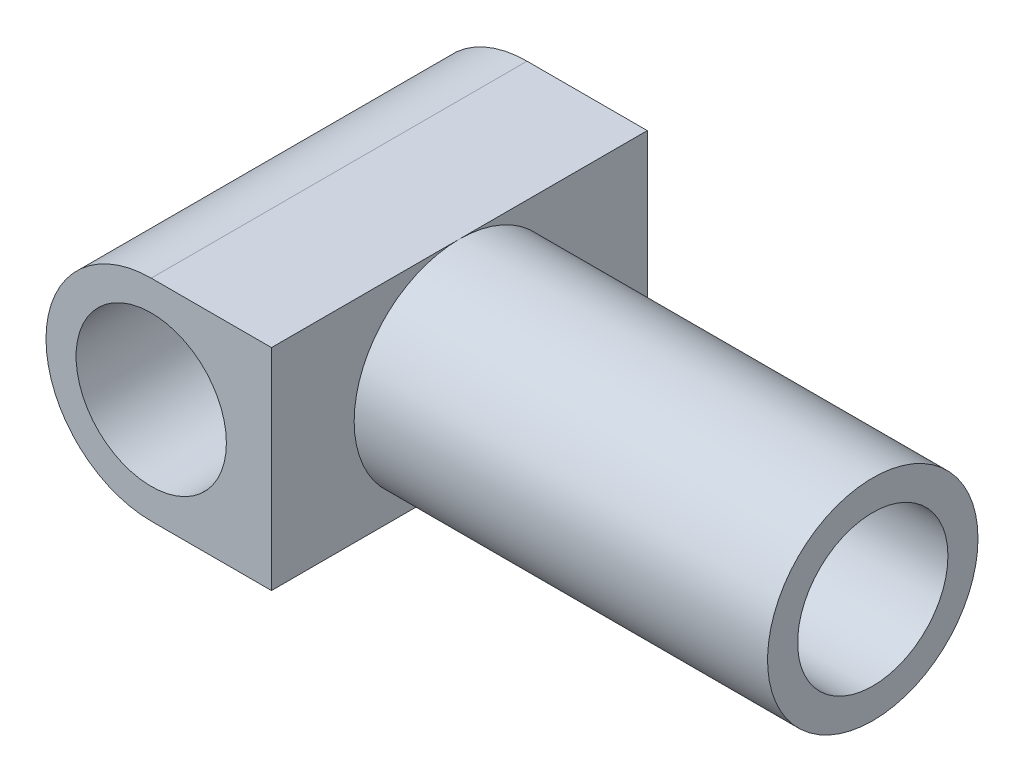
ISO-10303-21;
HEADER;
FILE_DESCRIPTION(('STEP AP214'),'2;1');
FILE_NAME('part.step','',(''),(''),'','','');
FILE_SCHEMA(('AUTOMOTIVE_DESIGN { 1 0 10303 214 1 1 1 1 }'));
ENDSEC;
DATA;
#1=APPLICATION_CONTEXT('core data for automotive mechanical design processes');
#2=APPLICATION_PROTOCOL_DEFINITION('international standard','automotive_design',2000,#1);
#3=PRODUCT_CONTEXT('',#1,'mechanical');
#4=PRODUCT('Part','Part','',(#3));
#5=PRODUCT_RELATED_PRODUCT_CATEGORY('part','',(#4));
#6=PRODUCT_DEFINITION_FORMATION('','',#4);
#7=PRODUCT_DEFINITION_CONTEXT('part definition',#1,'design');
#8=PRODUCT_DEFINITION('design','',#6,#7);
#9=PRODUCT_DEFINITION_SHAPE('','',#8);
#10=(LENGTH_UNIT() NAMED_UNIT(*) SI_UNIT(.MILLI.,.METRE.));
#11=(NAMED_UNIT(*) PLANE_ANGLE_UNIT() SI_UNIT($,.RADIAN.));
#12=(NAMED_UNIT(*) SI_UNIT($,.STERADIAN.) SOLID_ANGLE_UNIT());
#13=UNCERTAINTY_MEASURE_WITH_UNIT(LENGTH_MEASURE(1.E-05),#10,'distance_accuracy_value','');
#14=(GEOMETRIC_REPRESENTATION_CONTEXT(3) GLOBAL_UNCERTAINTY_ASSIGNED_CONTEXT((#13)) GLOBAL_UNIT_ASSIGNED_CONTEXT((#10,
#11,#12)) REPRESENTATION_CONTEXT('',''));
#15=CARTESIAN_POINT('',(0.,0.,0.));
#16=DIRECTION('',(0.,0.,1.));
#17=DIRECTION('',(1.,0.,0.));
#18=AXIS2_PLACEMENT_3D('',#15,#16,#17);
#19=CARTESIAN_POINT('',(8.,7.,25.));
#20=DIRECTION('',(-1.,0.,0.));
#21=DIRECTION('',(0.,0.,1.));
#22=AXIS2_PLACEMENT_3D('',#19,#20,#21);
#23=PLANE('',#22);
#24=CARTESIAN_POINT('',(8.,0.,12.5));
#25=DIRECTION('',(1.,0.,0.));
#26=DIRECTION('',(0.,0.,-1.));
#27=AXIS2_PLACEMENT_3D('',#24,#25,#26);
#28=CIRCLE('',#27,7.);
#29=CARTESIAN_POINT('',(8.,7.,12.5));
#30=VERTEX_POINT('',#29);
#31=CARTESIAN_POINT('',(8.,-7.,12.5));
#32=VERTEX_POINT('',#31);
#33=EDGE_CURVE('E56',#30,#32,#28,.T.);
#34=ORIENTED_EDGE('',*,*,#33,.F.);
#35=DIRECTION('',(0.,0.,-1.));
#36=VECTOR('',#35,1.);
#37=CARTESIAN_POINT('',(8.,7.,25.));
#38=LINE('',#37,#36);
#39=CARTESIAN_POINT('',(8.,7.,25.));
#40=VERTEX_POINT('',#39);
#41=EDGE_CURVE('E101',#40,#30,#38,.T.);
#42=ORIENTED_EDGE('',*,*,#41,.F.);
#43=DIRECTION('',(0.,1.,0.));
#44=VECTOR('',#43,1.);
#45=CARTESIAN_POINT('',(8.,7.,25.));
#46=LINE('',#45,#44);
#47=CARTESIAN_POINT('',(8.,-7.,25.));
#48=VERTEX_POINT('',#47);
#49=EDGE_CURVE('E185',#48,#40,#46,.T.);
#50=ORIENTED_EDGE('',*,*,#49,.F.);
#51=DIRECTION('',(0.,0.,-1.));
#52=VECTOR('',#51,1.);
#53=CARTESIAN_POINT('',(8.,-7.,25.));
#54=LINE('',#53,#52);
#55=EDGE_CURVE('E118',#48,#32,#54,.T.);
#56=ORIENTED_EDGE('',*,*,#55,.T.);
#57=EDGE_LOOP('',(#34,#42,#50,#56));
#58=FACE_BOUND('',#57,.T.);
#59=ADVANCED_FACE('F45',(#58),#23,.F.);
#60=CARTESIAN_POINT('',(0.,0.,25.));
#61=DIRECTION('',(0.,0.,1.));
#62=DIRECTION('',(1.,0.,0.));
#63=AXIS2_PLACEMENT_3D('',#60,#61,#62);
#64=PLANE('',#63);
#65=CARTESIAN_POINT('',(0.,0.,25.));
#66=DIRECTION('',(0.,0.,1.));
#67=DIRECTION('',(1.,0.,0.));
#68=AXIS2_PLACEMENT_3D('',#65,#66,#67);
#69=CIRCLE('',#68,7.);
#70=CARTESIAN_POINT('',(0.,7.,25.));
#71=VERTEX_POINT('',#70);
#72=CARTESIAN_POINT('',(0.,-7.,25.));
#73=VERTEX_POINT('',#72);
#74=EDGE_CURVE('E175',#71,#73,#69,.T.);
#75=ORIENTED_EDGE('',*,*,#74,.T.);
#76=DIRECTION('',(1.,0.,0.));
#77=VECTOR('',#76,1.);
#78=CARTESIAN_POINT('',(8.,-7.,25.));
#79=LINE('',#78,#77);
#80=EDGE_CURVE('E97',#73,#48,#79,.T.);
#81=ORIENTED_EDGE('',*,*,#80,.T.);
#82=ORIENTED_EDGE('',*,*,#49,.T.);
#83=DIRECTION('',(-1.,0.,0.));
#84=VECTOR('',#83,1.);
#85=CARTESIAN_POINT('',(0.,7.,25.));
#86=LINE('',#85,#84);
#87=EDGE_CURVE('E70',#40,#71,#86,.T.);
#88=ORIENTED_EDGE('',*,*,#87,.T.);
#89=EDGE_LOOP('',(#75,#81,#82,#88));
#90=FACE_BOUND('',#89,.T.);
#91=CARTESIAN_POINT('',(0.,0.,25.));
#92=DIRECTION('',(0.,0.,1.));
#93=DIRECTION('',(1.,0.,0.));
#94=AXIS2_PLACEMENT_3D('',#91,#92,#93);
#95=CIRCLE('',#94,5.);
#96=CARTESIAN_POINT('',(5.,0.,25.));
#97=VERTEX_POINT('',#96);
#98=EDGE_CURVE('E197',#97,#97,#95,.T.);
#99=ORIENTED_EDGE('',*,*,#98,.F.);
#100=EDGE_LOOP('',(#99));
#101=FACE_BOUND('',#100,.T.);
#102=ADVANCED_FACE('F142',(#90,#101),#64,.T.);
#103=CARTESIAN_POINT('',(0.,0.,0.));
#104=DIRECTION('',(0.,0.,1.));
#105=DIRECTION('',(1.,0.,0.));
#106=AXIS2_PLACEMENT_3D('',#103,#104,#105);
#107=PLANE('',#106);
#108=CARTESIAN_POINT('',(0.,0.,0.));
#109=DIRECTION('',(0.,0.,1.));
#110=DIRECTION('',(1.,0.,0.));
#111=AXIS2_PLACEMENT_3D('',#108,#109,#110);
#112=CIRCLE('',#111,7.);
#113=CARTESIAN_POINT('',(0.,7.,0.));
#114=VERTEX_POINT('',#113);
#115=CARTESIAN_POINT('',(0.,-7.,0.));
#116=VERTEX_POINT('',#115);
#117=EDGE_CURVE('E169',#114,#116,#112,.T.);
#118=ORIENTED_EDGE('',*,*,#117,.F.);
#119=DIRECTION('',(-1.,0.,0.));
#120=VECTOR('',#119,1.);
#121=CARTESIAN_POINT('',(0.,7.,0.));
#122=LINE('',#121,#120);
#123=CARTESIAN_POINT('',(8.,7.,0.));
#124=VERTEX_POINT('',#123);
#125=EDGE_CURVE('E89',#124,#114,#122,.T.);
#126=ORIENTED_EDGE('',*,*,#125,.F.);
#127=DIRECTION('',(0.,1.,0.));
#128=VECTOR('',#127,1.);
#129=CARTESIAN_POINT('',(8.,7.,0.));
#130=LINE('',#129,#128);
#131=CARTESIAN_POINT('',(8.,-7.,0.));
#132=VERTEX_POINT('',#131);
#133=EDGE_CURVE('E113',#132,#124,#130,.T.);
#134=ORIENTED_EDGE('',*,*,#133,.F.);
#135=DIRECTION('',(1.,0.,0.));
#136=VECTOR('',#135,1.);
#137=CARTESIAN_POINT('',(8.,-7.,0.));
#138=LINE('',#137,#136);
#139=EDGE_CURVE('E163',#116,#132,#138,.T.);
#140=ORIENTED_EDGE('',*,*,#139,.F.);
#141=EDGE_LOOP('',(#118,#126,#134,#140));
#142=FACE_BOUND('',#141,.T.);
#143=CARTESIAN_POINT('',(0.,0.,0.));
#144=DIRECTION('',(0.,0.,1.));
#145=DIRECTION('',(1.,0.,0.));
#146=AXIS2_PLACEMENT_3D('',#143,#144,#145);
#147=CIRCLE('',#146,5.);
#148=CARTESIAN_POINT('',(5.,0.,0.));
#149=VERTEX_POINT('',#148);
#150=EDGE_CURVE('E194',#149,#149,#147,.T.);
#151=ORIENTED_EDGE('',*,*,#150,.T.);
#152=EDGE_LOOP('',(#151));
#153=FACE_BOUND('',#152,.T.);
#154=ADVANCED_FACE('F147',(#142,#153),#107,.F.);
#155=CARTESIAN_POINT('',(0.,0.,25.));
#156=DIRECTION('',(0.,0.,-1.));
#157=DIRECTION('',(-1.,0.,0.));
#158=AXIS2_PLACEMENT_3D('',#155,#156,#157);
#159=CYLINDRICAL_SURFACE('',#158,7.);
#160=ORIENTED_EDGE('',*,*,#117,.T.);
#161=DIRECTION('',(0.,0.,-1.));
#162=VECTOR('',#161,1.);
#163=CARTESIAN_POINT('',(0.,-7.,25.));
#164=LINE('',#163,#162);
#165=EDGE_CURVE('E49',#73,#116,#164,.T.);
#166=ORIENTED_EDGE('',*,*,#165,.F.);
#167=ORIENTED_EDGE('',*,*,#74,.F.);
#168=DIRECTION('',(0.,0.,-1.));
#169=VECTOR('',#168,1.);
#170=CARTESIAN_POINT('',(0.,7.,25.));
#171=LINE('',#170,#169);
#172=EDGE_CURVE('E115',#71,#114,#171,.T.);
#173=ORIENTED_EDGE('',*,*,#172,.T.);
#174=EDGE_LOOP('',(#160,#166,#167,#173));
#175=FACE_BOUND('',#174,.T.);
#176=ADVANCED_FACE('F47',(#175),#159,.T.);
#177=CARTESIAN_POINT('',(8.,-7.,25.));
#178=DIRECTION('',(0.,1.,0.));
#179=DIRECTION('',(0.,0.,1.));
#180=AXIS2_PLACEMENT_3D('',#177,#178,#179);
#181=PLANE('',#180);
#182=ORIENTED_EDGE('',*,*,#139,.T.);
#183=EDGE_CURVE('E109',#32,#132,#54,.T.);
#184=ORIENTED_EDGE('',*,*,#183,.F.);
#185=ORIENTED_EDGE('',*,*,#55,.F.);
#186=ORIENTED_EDGE('',*,*,#80,.F.);
#187=ORIENTED_EDGE('',*,*,#165,.T.);
#188=EDGE_LOOP('',(#182,#184,#185,#186,#187));
#189=FACE_BOUND('',#188,.T.);
#190=ADVANCED_FACE('F153',(#189),#181,.F.);
#191=EDGE_CURVE('E11',#32,#30,#28,.T.);
#192=ORIENTED_EDGE('',*,*,#191,.F.);
#193=ORIENTED_EDGE('',*,*,#183,.T.);
#194=ORIENTED_EDGE('',*,*,#133,.T.);
#195=EDGE_CURVE('E103',#30,#124,#38,.T.);
#196=ORIENTED_EDGE('',*,*,#195,.F.);
#197=EDGE_LOOP('',(#192,#193,#194,#196));
#198=FACE_BOUND('',#197,.T.);
#199=ADVANCED_FACE('F111',(#198),#23,.F.);
#200=CARTESIAN_POINT('',(0.,7.,25.));
#201=DIRECTION('',(0.,-1.,0.));
#202=DIRECTION('',(0.,0.,-1.));
#203=AXIS2_PLACEMENT_3D('',#200,#201,#202);
#204=PLANE('',#203);
#205=ORIENTED_EDGE('',*,*,#125,.T.);
#206=ORIENTED_EDGE('',*,*,#172,.F.);
#207=ORIENTED_EDGE('',*,*,#87,.F.);
#208=ORIENTED_EDGE('',*,*,#41,.T.);
#209=ORIENTED_EDGE('',*,*,#195,.T.);
#210=EDGE_LOOP('',(#205,#206,#207,#208,#209));
#211=FACE_BOUND('',#210,.T.);
#212=ADVANCED_FACE('F102',(#211),#204,.F.);
#213=CARTESIAN_POINT('',(0.,0.,25.));
#214=DIRECTION('',(0.,0.,-1.));
#215=DIRECTION('',(-1.,0.,0.));
#216=AXIS2_PLACEMENT_3D('',#213,#214,#215);
#217=CYLINDRICAL_SURFACE('',#216,5.);
#218=ORIENTED_EDGE('',*,*,#98,.T.);
#219=EDGE_LOOP('',(#218));
#220=FACE_BOUND('',#219,.T.);
#221=ORIENTED_EDGE('',*,*,#150,.F.);
#222=EDGE_LOOP('',(#221));
#223=FACE_BOUND('',#222,.T.);
#224=ADVANCED_FACE('F136',(#220,#223),#217,.F.);
#225=CARTESIAN_POINT('',(35.5,0.,12.5));
#226=DIRECTION('',(1.,0.,0.));
#227=DIRECTION('',(0.,0.,-1.));
#228=AXIS2_PLACEMENT_3D('',#225,#226,#227);
#229=PLANE('',#228);
#230=CARTESIAN_POINT('',(35.5,0.,12.5));
#231=DIRECTION('',(1.,0.,0.));
#232=DIRECTION('',(0.,0.,-1.));
#233=AXIS2_PLACEMENT_3D('',#230,#231,#232);
#234=CIRCLE('',#233,7.);
#235=CARTESIAN_POINT('',(35.5,0.,5.5));
#236=VERTEX_POINT('',#235);
#237=EDGE_CURVE('E121',#236,#236,#234,.T.);
#238=ORIENTED_EDGE('',*,*,#237,.T.);
#239=EDGE_LOOP('',(#238));
#240=FACE_BOUND('',#239,.T.);
#241=CARTESIAN_POINT('',(35.5,0.,12.5));
#242=DIRECTION('',(1.,0.,0.));
#243=DIRECTION('',(0.,0.,-1.));
#244=AXIS2_PLACEMENT_3D('',#241,#242,#243);
#245=CIRCLE('',#244,5.);
#246=CARTESIAN_POINT('',(35.5,0.,7.5));
#247=VERTEX_POINT('',#246);
#248=EDGE_CURVE('E122',#247,#247,#245,.T.);
#249=ORIENTED_EDGE('',*,*,#248,.F.);
#250=EDGE_LOOP('',(#249));
#251=FACE_BOUND('',#250,.T.);
#252=ADVANCED_FACE('F126',(#240,#251),#229,.T.);
#253=CARTESIAN_POINT('',(35.5,0.,12.5));
#254=DIRECTION('',(-1.,0.,0.));
#255=DIRECTION('',(0.,0.,1.));
#256=AXIS2_PLACEMENT_3D('',#253,#254,#255);
#257=CYLINDRICAL_SURFACE('',#256,7.);
#258=ORIENTED_EDGE('',*,*,#237,.F.);
#259=EDGE_LOOP('',(#258));
#260=FACE_BOUND('',#259,.T.);
#261=ORIENTED_EDGE('',*,*,#33,.T.);
#262=ORIENTED_EDGE('',*,*,#191,.T.);
#263=EDGE_LOOP('',(#261,#262));
#264=FACE_BOUND('',#263,.T.);
#265=ADVANCED_FACE('F123',(#260,#264),#257,.T.);
#266=CARTESIAN_POINT('',(35.5,0.,12.5));
#267=DIRECTION('',(-1.,0.,0.));
#268=DIRECTION('',(0.,0.,1.));
#269=AXIS2_PLACEMENT_3D('',#266,#267,#268);
#270=CYLINDRICAL_SURFACE('',#269,5.);
#271=ORIENTED_EDGE('',*,*,#248,.T.);
#272=EDGE_LOOP('',(#271));
#273=FACE_BOUND('',#272,.T.);
#274=CARTESIAN_POINT('',(8.,0.,12.5));
#275=DIRECTION('',(1.,0.,0.));
#276=DIRECTION('',(0.,0.,-1.));
#277=AXIS2_PLACEMENT_3D('',#274,#275,#276);
#278=CIRCLE('',#277,5.);
#279=CARTESIAN_POINT('',(8.,0.,7.5));
#280=VERTEX_POINT('',#279);
#281=EDGE_CURVE('E208',#280,#280,#278,.T.);
#282=ORIENTED_EDGE('',*,*,#281,.F.);
#283=EDGE_LOOP('',(#282));
#284=FACE_BOUND('',#283,.T.);
#285=ADVANCED_FACE('F125',(#273,#284),#270,.F.);
#286=ORIENTED_EDGE('',*,*,#281,.T.);
#287=EDGE_LOOP('',(#286));
#288=FACE_BOUND('',#287,.T.);
#289=ADVANCED_FACE('F133',(#288),#23,.F.);
#290=CLOSED_SHELL('',(#59,#102,#154,#176,#190,#199,#212,#224,#252,#265,#285,#289));
#291=MANIFOLD_SOLID_BREP('B2',#290);
#292=ADVANCED_BREP_SHAPE_REPRESENTATION('',(#18,#291),#14);
#293=SHAPE_DEFINITION_REPRESENTATION(#9,#292);
ENDSEC;
END-ISO-10303-21;
